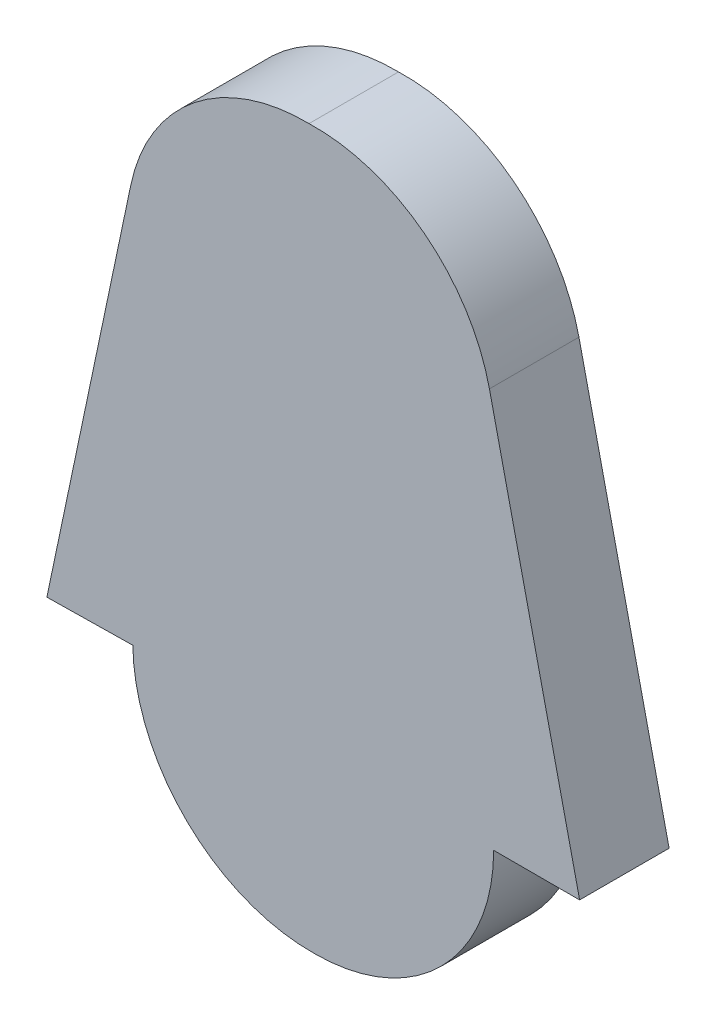
ISO-10303-21;
HEADER;
FILE_DESCRIPTION(('STEP AP214'),'2;1');
FILE_NAME('part.step','',(''),(''),'','','');
FILE_SCHEMA(('AUTOMOTIVE_DESIGN { 1 0 10303 214 1 1 1 1 }'));
ENDSEC;
DATA;
#1=APPLICATION_CONTEXT('core data for automotive mechanical design processes');
#2=APPLICATION_PROTOCOL_DEFINITION('international standard','automotive_design',2000,#1);
#3=PRODUCT_CONTEXT('',#1,'mechanical');
#4=PRODUCT('Part','Part','',(#3));
#5=PRODUCT_RELATED_PRODUCT_CATEGORY('part','',(#4));
#6=PRODUCT_DEFINITION_FORMATION('','',#4);
#7=PRODUCT_DEFINITION_CONTEXT('part definition',#1,'design');
#8=PRODUCT_DEFINITION('design','',#6,#7);
#9=PRODUCT_DEFINITION_SHAPE('','',#8);
#10=(LENGTH_UNIT() NAMED_UNIT(*) SI_UNIT(.MILLI.,.METRE.));
#11=(NAMED_UNIT(*) PLANE_ANGLE_UNIT() SI_UNIT($,.RADIAN.));
#12=(NAMED_UNIT(*) SI_UNIT($,.STERADIAN.) SOLID_ANGLE_UNIT());
#13=UNCERTAINTY_MEASURE_WITH_UNIT(LENGTH_MEASURE(1.E-05),#10,'distance_accuracy_value','');
#14=(GEOMETRIC_REPRESENTATION_CONTEXT(3) GLOBAL_UNCERTAINTY_ASSIGNED_CONTEXT((#13)) GLOBAL_UNIT_ASSIGNED_CONTEXT((#10,
#11,#12)) REPRESENTATION_CONTEXT('',''));
#15=CARTESIAN_POINT('',(0.,0.,0.));
#16=DIRECTION('',(0.,0.,1.));
#17=DIRECTION('',(1.,0.,0.));
#18=AXIS2_PLACEMENT_3D('',#15,#16,#17);
#19=CARTESIAN_POINT('',(45.4338786217879,0.496627263893205,1.5875));
#20=DIRECTION('',(0.,0.,-1.));
#21=DIRECTION('',(-1.,0.,0.));
#22=AXIS2_PLACEMENT_3D('',#19,#20,#21);
#23=CYLINDRICAL_SURFACE('',#22,6.35709139601046);
#24=CARTESIAN_POINT('',(45.4338786217879,0.496627263893205,-1.5875));
#25=DIRECTION('',(0.,0.,1.));
#26=DIRECTION('',(-1.,0.,0.));
#27=AXIS2_PLACEMENT_3D('',#24,#25,#26);
#28=CIRCLE('',#27,6.35709139601046);
#29=CARTESIAN_POINT('',(45.533364228987,6.85294015984086,-1.5875));
#30=VERTEX_POINT('',#29);
#31=CARTESIAN_POINT('',(39.2130111711439,1.80560364975627,-1.5875));
#32=VERTEX_POINT('',#31);
#33=EDGE_CURVE('E130',#30,#32,#28,.T.);
#34=ORIENTED_EDGE('',*,*,#33,.T.);
#35=DIRECTION('',(0.,0.,-1.));
#36=VECTOR('',#35,1.);
#37=CARTESIAN_POINT('',(39.2130111711439,1.80560364975627,1.5875));
#38=LINE('',#37,#36);
#39=CARTESIAN_POINT('',(39.2130111711439,1.80560364975627,1.5875));
#40=VERTEX_POINT('',#39);
#41=EDGE_CURVE('E11',#40,#32,#38,.T.);
#42=ORIENTED_EDGE('',*,*,#41,.F.);
#43=CARTESIAN_POINT('',(45.4338786217879,0.496627263893205,1.5875));
#44=DIRECTION('',(0.,0.,1.));
#45=DIRECTION('',(-1.,0.,0.));
#46=AXIS2_PLACEMENT_3D('',#43,#44,#45);
#47=CIRCLE('',#46,6.35709139601046);
#48=CARTESIAN_POINT('',(45.533364228987,6.85294015984086,1.5875));
#49=VERTEX_POINT('',#48);
#50=EDGE_CURVE('E144',#49,#40,#47,.T.);
#51=ORIENTED_EDGE('',*,*,#50,.F.);
#52=DIRECTION('',(0.,0.,-1.));
#53=VECTOR('',#52,1.);
#54=CARTESIAN_POINT('',(45.533364228987,6.85294015984086,1.5875));
#55=LINE('',#54,#53);
#56=EDGE_CURVE('E126',#49,#30,#55,.T.);
#57=ORIENTED_EDGE('',*,*,#56,.T.);
#58=EDGE_LOOP('',(#34,#42,#51,#57));
#59=FACE_BOUND('',#58,.T.);
#60=ADVANCED_FACE('F34',(#59),#23,.T.);
#61=CARTESIAN_POINT('',(36.2360923678539,-12.3421055729632,1.5875));
#62=DIRECTION('',(0.978571340746829,-0.205908064603969,0.));
#63=DIRECTION('',(0.205908064603969,0.97857134074683,0.));
#64=AXIS2_PLACEMENT_3D('',#61,#62,#63);
#65=PLANE('',#64);
#66=DIRECTION('',(-0.205908064603969,-0.978571340746829,0.));
#67=VECTOR('',#66,1.);
#68=CARTESIAN_POINT('',(36.2360923678539,-12.3421055729632,-1.5875));
#69=LINE('',#68,#67);
#70=CARTESIAN_POINT('',(36.2360923678539,-12.3421055729632,-1.5875));
#71=VERTEX_POINT('',#70);
#72=EDGE_CURVE('E133',#32,#71,#69,.T.);
#73=ORIENTED_EDGE('',*,*,#72,.T.);
#74=DIRECTION('',(0.,0.,-1.));
#75=VECTOR('',#74,1.);
#76=CARTESIAN_POINT('',(36.2360923678539,-12.3421055729632,1.5875));
#77=LINE('',#76,#75);
#78=CARTESIAN_POINT('',(36.2360923678539,-12.3421055729632,1.5875));
#79=VERTEX_POINT('',#78);
#80=EDGE_CURVE('E42',#79,#71,#77,.T.);
#81=ORIENTED_EDGE('',*,*,#80,.F.);
#82=DIRECTION('',(-0.205908064603969,-0.978571340746829,0.));
#83=VECTOR('',#82,1.);
#84=CARTESIAN_POINT('',(36.2360923678539,-12.3421055729632,1.5875));
#85=LINE('',#84,#83);
#86=EDGE_CURVE('E93',#40,#79,#85,.T.);
#87=ORIENTED_EDGE('',*,*,#86,.F.);
#88=ORIENTED_EDGE('',*,*,#41,.T.);
#89=EDGE_LOOP('',(#73,#81,#87,#88));
#90=FACE_BOUND('',#89,.T.);
#91=ADVANCED_FACE('F179',(#90),#65,.F.);
#92=CARTESIAN_POINT('',(39.2837175255812,-12.2943049663993,1.5875));
#93=DIRECTION('',(-0.0156826137020431,0.999877020251727,0.));
#94=DIRECTION('',(-0.999877020251727,-0.0156826137020431,0.));
#95=AXIS2_PLACEMENT_3D('',#92,#93,#94);
#96=PLANE('',#95);
#97=DIRECTION('',(0.999877020251727,0.0156826137020431,0.));
#98=VECTOR('',#97,1.);
#99=CARTESIAN_POINT('',(39.2837175255812,-12.2943049663993,-1.5875));
#100=LINE('',#99,#98);
#101=CARTESIAN_POINT('',(39.2837175255812,-12.2943049663993,-1.5875));
#102=VERTEX_POINT('',#101);
#103=EDGE_CURVE('E135',#71,#102,#100,.T.);
#104=ORIENTED_EDGE('',*,*,#103,.T.);
#105=DIRECTION('',(0.,0.,-1.));
#106=VECTOR('',#105,1.);
#107=CARTESIAN_POINT('',(39.2837175255812,-12.2943049663993,1.5875));
#108=LINE('',#107,#106);
#109=CARTESIAN_POINT('',(39.2837175255812,-12.2943049663993,1.5875));
#110=VERTEX_POINT('',#109);
#111=EDGE_CURVE('E151',#110,#102,#108,.T.);
#112=ORIENTED_EDGE('',*,*,#111,.F.);
#113=DIRECTION('',(0.999877020251727,0.0156826137020431,0.));
#114=VECTOR('',#113,1.);
#115=CARTESIAN_POINT('',(39.2837175255812,-12.2943049663993,1.5875));
#116=LINE('',#115,#114);
#117=EDGE_CURVE('E159',#79,#110,#116,.T.);
#118=ORIENTED_EDGE('',*,*,#117,.F.);
#119=ORIENTED_EDGE('',*,*,#80,.T.);
#120=EDGE_LOOP('',(#104,#112,#118,#119));
#121=FACE_BOUND('',#120,.T.);
#122=ADVANCED_FACE('F157',(#121),#96,.F.);
#123=CARTESIAN_POINT('',(45.6329366041796,-12.1947203693914,1.5875));
#124=DIRECTION('',(0.,0.,-1.));
#125=DIRECTION('',(-1.,0.,0.));
#126=AXIS2_PLACEMENT_3D('',#123,#124,#125);
#127=CYLINDRICAL_SURFACE('',#126,6.34999999999999);
#128=CARTESIAN_POINT('',(45.6329366041796,-12.1947203693914,-1.5875));
#129=DIRECTION('',(0.,0.,1.));
#130=DIRECTION('',(-1.,0.,0.));
#131=AXIS2_PLACEMENT_3D('',#128,#129,#130);
#132=CIRCLE('',#131,6.34999999999999);
#133=CARTESIAN_POINT('',(45.7325212011876,-18.5439394479898,-1.5875));
#134=VERTEX_POINT('',#133);
#135=EDGE_CURVE('E137',#102,#134,#132,.T.);
#136=ORIENTED_EDGE('',*,*,#135,.T.);
#137=DIRECTION('',(0.,0.,-1.));
#138=VECTOR('',#137,1.);
#139=CARTESIAN_POINT('',(45.7325212011876,-18.5439394479898,1.5875));
#140=LINE('',#139,#138);
#141=CARTESIAN_POINT('',(45.7325212011876,-18.5439394479898,1.5875));
#142=VERTEX_POINT('',#141);
#143=EDGE_CURVE('E148',#142,#134,#140,.T.);
#144=ORIENTED_EDGE('',*,*,#143,.F.);
#145=CARTESIAN_POINT('',(45.6329366041796,-12.1947203693914,1.5875));
#146=DIRECTION('',(0.,0.,1.));
#147=DIRECTION('',(-1.,0.,0.));
#148=AXIS2_PLACEMENT_3D('',#145,#146,#147);
#149=CIRCLE('',#148,6.34999999999999);
#150=EDGE_CURVE('E171',#110,#142,#149,.T.);
#151=ORIENTED_EDGE('',*,*,#150,.F.);
#152=ORIENTED_EDGE('',*,*,#111,.T.);
#153=EDGE_LOOP('',(#136,#144,#151,#152));
#154=FACE_BOUND('',#153,.T.);
#155=ADVANCED_FACE('F167',(#154),#127,.T.);
#156=CARTESIAN_POINT('',(45.7325212011876,-12.1939394479898,1.5875));
#157=DIRECTION('',(0.,0.,-1.));
#158=DIRECTION('',(-1.,0.,0.));
#159=AXIS2_PLACEMENT_3D('',#156,#157,#158);
#160=CYLINDRICAL_SURFACE('',#159,6.35);
#161=CARTESIAN_POINT('',(45.7325212011876,-12.1939394479898,-1.5875));
#162=DIRECTION('',(0.,0.,1.));
#163=DIRECTION('',(1.,0.,0.));
#164=AXIS2_PLACEMENT_3D('',#161,#162,#163);
#165=CIRCLE('',#164,6.35);
#166=CARTESIAN_POINT('',(52.0825212011876,-12.1939394479898,-1.5875));
#167=VERTEX_POINT('',#166);
#168=EDGE_CURVE('E139',#134,#167,#165,.T.);
#169=ORIENTED_EDGE('',*,*,#168,.T.);
#170=DIRECTION('',(0.,0.,-1.));
#171=VECTOR('',#170,1.);
#172=CARTESIAN_POINT('',(52.0825212011876,-12.1939394479898,1.5875));
#173=LINE('',#172,#171);
#174=CARTESIAN_POINT('',(52.0825212011876,-12.1939394479898,1.5875));
#175=VERTEX_POINT('',#174);
#176=EDGE_CURVE('E121',#175,#167,#173,.T.);
#177=ORIENTED_EDGE('',*,*,#176,.F.);
#178=CARTESIAN_POINT('',(45.7325212011876,-12.1939394479898,1.5875));
#179=DIRECTION('',(0.,0.,1.));
#180=DIRECTION('',(1.,0.,0.));
#181=AXIS2_PLACEMENT_3D('',#178,#179,#180);
#182=CIRCLE('',#181,6.35);
#183=EDGE_CURVE('E112',#142,#175,#182,.T.);
#184=ORIENTED_EDGE('',*,*,#183,.F.);
#185=ORIENTED_EDGE('',*,*,#143,.T.);
#186=EDGE_LOOP('',(#169,#177,#184,#185));
#187=FACE_BOUND('',#186,.T.);
#188=ADVANCED_FACE('F170',(#187),#160,.T.);
#189=CARTESIAN_POINT('',(52.0825212011876,-12.1939394479898,1.5875));
#190=DIRECTION('',(0.,1.,0.));
#191=DIRECTION('',(0.,0.,1.));
#192=AXIS2_PLACEMENT_3D('',#189,#190,#191);
#193=PLANE('',#192);
#194=DIRECTION('',(1.,0.,0.));
#195=VECTOR('',#194,1.);
#196=CARTESIAN_POINT('',(52.0825212011876,-12.1939394479898,-1.5875));
#197=LINE('',#196,#195);
#198=CARTESIAN_POINT('',(55.1305212011876,-12.1939394479898,-1.5875));
#199=VERTEX_POINT('',#198);
#200=EDGE_CURVE('E120',#167,#199,#197,.T.);
#201=ORIENTED_EDGE('',*,*,#200,.T.);
#202=DIRECTION('',(0.,0.,-1.));
#203=VECTOR('',#202,1.);
#204=CARTESIAN_POINT('',(55.1305212011876,-12.1939394479898,1.5875));
#205=LINE('',#204,#203);
#206=CARTESIAN_POINT('',(55.1305212011876,-12.1939394479898,1.5875));
#207=VERTEX_POINT('',#206);
#208=EDGE_CURVE('E117',#207,#199,#205,.T.);
#209=ORIENTED_EDGE('',*,*,#208,.F.);
#210=DIRECTION('',(1.,0.,0.));
#211=VECTOR('',#210,1.);
#212=CARTESIAN_POINT('',(52.0825212011876,-12.1939394479898,1.5875));
#213=LINE('',#212,#211);
#214=EDGE_CURVE('E106',#175,#207,#213,.T.);
#215=ORIENTED_EDGE('',*,*,#214,.F.);
#216=ORIENTED_EDGE('',*,*,#176,.T.);
#217=EDGE_LOOP('',(#201,#209,#215,#216));
#218=FACE_BOUND('',#217,.T.);
#219=ADVANCED_FACE('F118',(#218),#193,.F.);
#220=CARTESIAN_POINT('',(55.1305212011876,-12.1939394479898,1.5875));
#221=DIRECTION('',(-0.975221819654358,-0.22122929839884,0.));
#222=DIRECTION('',(0.22122929839884,-0.975221819654358,0.));
#223=AXIS2_PLACEMENT_3D('',#220,#221,#222);
#224=PLANE('',#223);
#225=DIRECTION('',(-0.22122929839884,0.975221819654358,0.));
#226=VECTOR('',#225,1.);
#227=CARTESIAN_POINT('',(55.1305212011876,-12.1939394479898,-1.5875));
#228=LINE('',#227,#226);
#229=CARTESIAN_POINT('',(51.932095440114,1.90534402539641,-1.5875));
#230=VERTEX_POINT('',#229);
#231=EDGE_CURVE('E79',#199,#230,#228,.T.);
#232=ORIENTED_EDGE('',*,*,#231,.T.);
#233=DIRECTION('',(0.,0.,-1.));
#234=VECTOR('',#233,1.);
#235=CARTESIAN_POINT('',(51.932095440114,1.90534402539641,1.5875));
#236=LINE('',#235,#234);
#237=CARTESIAN_POINT('',(51.932095440114,1.90534402539641,1.5875));
#238=VERTEX_POINT('',#237);
#239=EDGE_CURVE('E122',#238,#230,#236,.T.);
#240=ORIENTED_EDGE('',*,*,#239,.F.);
#241=DIRECTION('',(-0.22122929839884,0.975221819654358,0.));
#242=VECTOR('',#241,1.);
#243=CARTESIAN_POINT('',(55.1305212011876,-12.1939394479898,1.5875));
#244=LINE('',#243,#242);
#245=EDGE_CURVE('E110',#207,#238,#244,.T.);
#246=ORIENTED_EDGE('',*,*,#245,.F.);
#247=ORIENTED_EDGE('',*,*,#208,.T.);
#248=EDGE_LOOP('',(#232,#240,#246,#247));
#249=FACE_BOUND('',#248,.T.);
#250=ADVANCED_FACE('F124',(#249),#224,.F.);
#251=CARTESIAN_POINT('',(45.7325212011876,0.498969155999712,1.5875));
#252=DIRECTION('',(0.,0.,-1.));
#253=DIRECTION('',(-1.,0.,0.));
#254=AXIS2_PLACEMENT_3D('',#251,#252,#253);
#255=CYLINDRICAL_SURFACE('',#254,6.35709139601046);
#256=CARTESIAN_POINT('',(45.7325212011876,0.498969155999712,-1.5875));
#257=DIRECTION('',(0.,0.,1.));
#258=DIRECTION('',(1.,0.,0.));
#259=AXIS2_PLACEMENT_3D('',#256,#257,#258);
#260=CIRCLE('',#259,6.35709139601046);
#261=EDGE_CURVE('E85',#230,#30,#260,.T.);
#262=ORIENTED_EDGE('',*,*,#261,.T.);
#263=ORIENTED_EDGE('',*,*,#56,.F.);
#264=CARTESIAN_POINT('',(45.7325212011876,0.498969155999712,1.5875));
#265=DIRECTION('',(0.,0.,1.));
#266=DIRECTION('',(1.,0.,0.));
#267=AXIS2_PLACEMENT_3D('',#264,#265,#266);
#268=CIRCLE('',#267,6.35709139601046);
#269=EDGE_CURVE('E50',#238,#49,#268,.T.);
#270=ORIENTED_EDGE('',*,*,#269,.F.);
#271=ORIENTED_EDGE('',*,*,#239,.T.);
#272=EDGE_LOOP('',(#262,#263,#270,#271));
#273=FACE_BOUND('',#272,.T.);
#274=ADVANCED_FACE('F195',(#273),#255,.T.);
#275=CARTESIAN_POINT('',(45.4338786217879,0.496627263893205,1.5875));
#276=DIRECTION('',(0.,0.,-1.));
#277=DIRECTION('',(-1.,0.,0.));
#278=AXIS2_PLACEMENT_3D('',#275,#276,#277);
#279=PLANE('',#278);
#280=ORIENTED_EDGE('',*,*,#50,.T.);
#281=ORIENTED_EDGE('',*,*,#86,.T.);
#282=ORIENTED_EDGE('',*,*,#117,.T.);
#283=ORIENTED_EDGE('',*,*,#150,.T.);
#284=ORIENTED_EDGE('',*,*,#183,.T.);
#285=ORIENTED_EDGE('',*,*,#214,.T.);
#286=ORIENTED_EDGE('',*,*,#245,.T.);
#287=ORIENTED_EDGE('',*,*,#269,.T.);
#288=EDGE_LOOP('',(#280,#281,#282,#283,#284,#285,#286,#287));
#289=FACE_BOUND('',#288,.T.);
#290=ADVANCED_FACE('F108',(#289),#279,.F.);
#291=CARTESIAN_POINT('',(45.4338786217879,0.496627263893205,-1.5875));
#292=DIRECTION('',(0.,0.,-1.));
#293=DIRECTION('',(-1.,0.,0.));
#294=AXIS2_PLACEMENT_3D('',#291,#292,#293);
#295=PLANE('',#294);
#296=ORIENTED_EDGE('',*,*,#33,.F.);
#297=ORIENTED_EDGE('',*,*,#261,.F.);
#298=ORIENTED_EDGE('',*,*,#231,.F.);
#299=ORIENTED_EDGE('',*,*,#200,.F.);
#300=ORIENTED_EDGE('',*,*,#168,.F.);
#301=ORIENTED_EDGE('',*,*,#135,.F.);
#302=ORIENTED_EDGE('',*,*,#103,.F.);
#303=ORIENTED_EDGE('',*,*,#72,.F.);
#304=EDGE_LOOP('',(#296,#297,#298,#299,#300,#301,#302,#303));
#305=FACE_BOUND('',#304,.T.);
#306=ADVANCED_FACE('F163',(#305),#295,.T.);
#307=CLOSED_SHELL('',(#60,#91,#122,#155,#188,#219,#250,#274,#290,#306));
#308=MANIFOLD_SOLID_BREP('B2',#307);
#309=ADVANCED_BREP_SHAPE_REPRESENTATION('',(#18,#308),#14);
#310=SHAPE_DEFINITION_REPRESENTATION(#9,#309);
ENDSEC;
END-ISO-10303-21;
